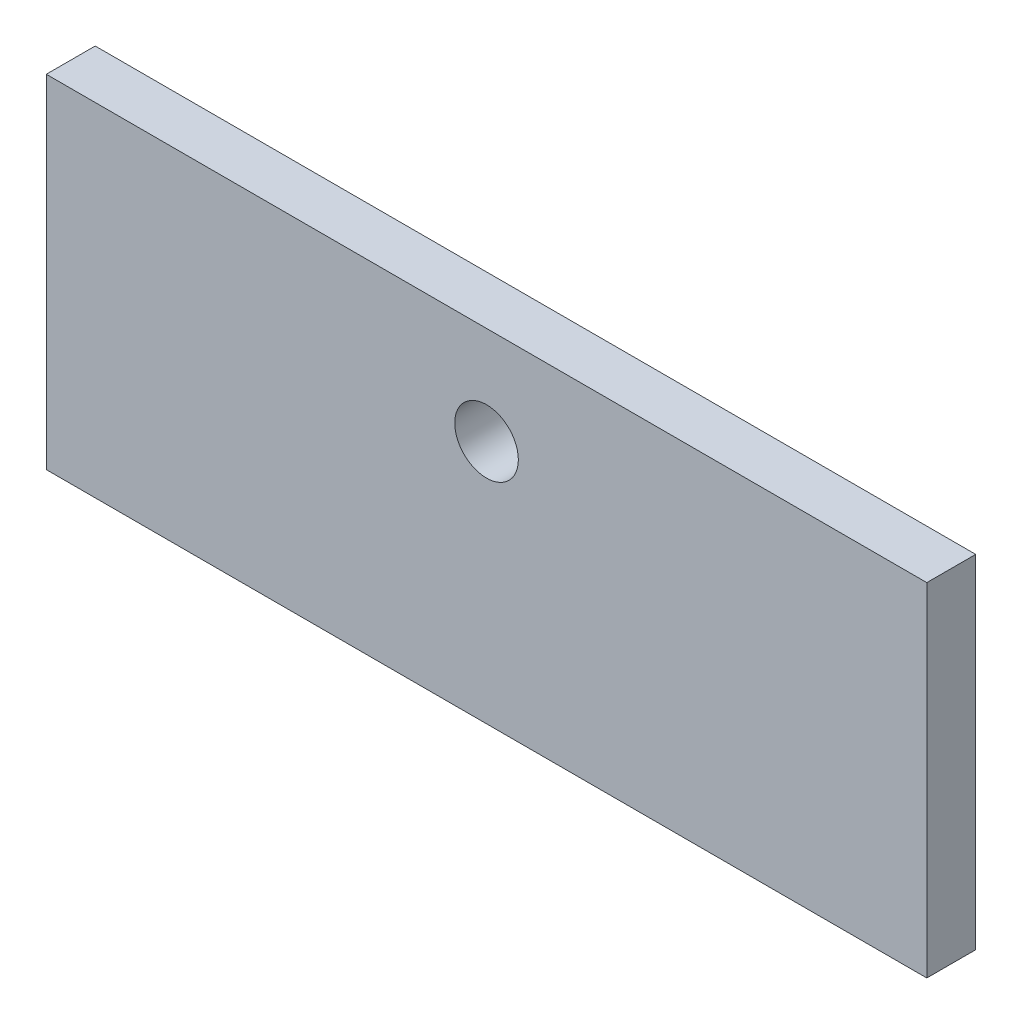
ISO-10303-21;
HEADER;
FILE_DESCRIPTION(('STEP AP214'),'2;1');
FILE_NAME('part.step','',(''),(''),'','','');
FILE_SCHEMA(('AUTOMOTIVE_DESIGN { 1 0 10303 214 1 1 1 1 }'));
ENDSEC;
DATA;
#1=APPLICATION_CONTEXT('core data for automotive mechanical design processes');
#2=APPLICATION_PROTOCOL_DEFINITION('international standard','automotive_design',2000,#1);
#3=PRODUCT_CONTEXT('',#1,'mechanical');
#4=PRODUCT('Part','Part','',(#3));
#5=PRODUCT_RELATED_PRODUCT_CATEGORY('part','',(#4));
#6=PRODUCT_DEFINITION_FORMATION('','',#4);
#7=PRODUCT_DEFINITION_CONTEXT('part definition',#1,'design');
#8=PRODUCT_DEFINITION('design','',#6,#7);
#9=PRODUCT_DEFINITION_SHAPE('','',#8);
#10=(LENGTH_UNIT() NAMED_UNIT(*) SI_UNIT(.MILLI.,.METRE.));
#11=(NAMED_UNIT(*) PLANE_ANGLE_UNIT() SI_UNIT($,.RADIAN.));
#12=(NAMED_UNIT(*) SI_UNIT($,.STERADIAN.) SOLID_ANGLE_UNIT());
#13=UNCERTAINTY_MEASURE_WITH_UNIT(LENGTH_MEASURE(1.E-05),#10,'distance_accuracy_value','');
#14=(GEOMETRIC_REPRESENTATION_CONTEXT(3) GLOBAL_UNCERTAINTY_ASSIGNED_CONTEXT((#13)) GLOBAL_UNIT_ASSIGNED_CONTEXT((#10,
#11,#12)) REPRESENTATION_CONTEXT('',''));
#15=CARTESIAN_POINT('',(0.,0.,0.));
#16=DIRECTION('',(0.,0.,1.));
#17=DIRECTION('',(1.,0.,0.));
#18=AXIS2_PLACEMENT_3D('',#15,#16,#17);
#19=CARTESIAN_POINT('',(0.,0.,5.));
#20=DIRECTION('',(0.,0.,-1.));
#21=DIRECTION('',(-1.,0.,0.));
#22=AXIS2_PLACEMENT_3D('',#19,#20,#21);
#23=PLANE('',#22);
#24=DIRECTION('',(0.,-1.,0.));
#25=VECTOR('',#24,1.);
#26=CARTESIAN_POINT('',(0.,0.,5.));
#27=LINE('',#26,#25);
#28=CARTESIAN_POINT('',(0.,35.,5.));
#29=VERTEX_POINT('',#28);
#30=CARTESIAN_POINT('',(0.,0.,5.));
#31=VERTEX_POINT('',#30);
#32=EDGE_CURVE('E87',#29,#31,#27,.T.);
#33=ORIENTED_EDGE('',*,*,#32,.T.);
#34=DIRECTION('',(1.,0.,0.));
#35=VECTOR('',#34,1.);
#36=CARTESIAN_POINT('',(0.,0.,5.));
#37=LINE('',#36,#35);
#38=CARTESIAN_POINT('',(90.,0.,5.));
#39=VERTEX_POINT('',#38);
#40=EDGE_CURVE('E82',#31,#39,#37,.T.);
#41=ORIENTED_EDGE('',*,*,#40,.T.);
#42=DIRECTION('',(0.,1.,0.));
#43=VECTOR('',#42,1.);
#44=CARTESIAN_POINT('',(90.,35.,5.));
#45=LINE('',#44,#43);
#46=CARTESIAN_POINT('',(90.,35.,5.));
#47=VERTEX_POINT('',#46);
#48=EDGE_CURVE('E85',#39,#47,#45,.T.);
#49=ORIENTED_EDGE('',*,*,#48,.T.);
#50=DIRECTION('',(-1.,0.,0.));
#51=VECTOR('',#50,1.);
#52=CARTESIAN_POINT('',(0.,35.,5.));
#53=LINE('',#52,#51);
#54=EDGE_CURVE('E52',#47,#29,#53,.T.);
#55=ORIENTED_EDGE('',*,*,#54,.T.);
#56=EDGE_LOOP('',(#33,#41,#49,#55));
#57=FACE_BOUND('',#56,.T.);
#58=CARTESIAN_POINT('',(45.,25.,5.));
#59=DIRECTION('',(0.,0.,1.));
#60=DIRECTION('',(1.,0.,0.));
#61=AXIS2_PLACEMENT_3D('',#58,#59,#60);
#62=CIRCLE('',#61,3.25);
#63=CARTESIAN_POINT('',(48.25,25.,5.));
#64=VERTEX_POINT('',#63);
#65=EDGE_CURVE('E102',#64,#64,#62,.T.);
#66=ORIENTED_EDGE('',*,*,#65,.F.);
#67=EDGE_LOOP('',(#66));
#68=FACE_BOUND('',#67,.T.);
#69=ADVANCED_FACE('F35',(#57,#68),#23,.F.);
#70=CARTESIAN_POINT('',(0.,0.,0.));
#71=DIRECTION('',(0.,0.,-1.));
#72=DIRECTION('',(-1.,0.,0.));
#73=AXIS2_PLACEMENT_3D('',#70,#71,#72);
#74=PLANE('',#73);
#75=DIRECTION('',(0.,-1.,0.));
#76=VECTOR('',#75,1.);
#77=CARTESIAN_POINT('',(0.,0.,0.));
#78=LINE('',#77,#76);
#79=CARTESIAN_POINT('',(0.,35.,0.));
#80=VERTEX_POINT('',#79);
#81=CARTESIAN_POINT('',(0.,0.,0.));
#82=VERTEX_POINT('',#81);
#83=EDGE_CURVE('E99',#80,#82,#78,.T.);
#84=ORIENTED_EDGE('',*,*,#83,.F.);
#85=DIRECTION('',(-1.,0.,0.));
#86=VECTOR('',#85,1.);
#87=CARTESIAN_POINT('',(0.,35.,0.));
#88=LINE('',#87,#86);
#89=CARTESIAN_POINT('',(90.,35.,0.));
#90=VERTEX_POINT('',#89);
#91=EDGE_CURVE('E75',#90,#80,#88,.T.);
#92=ORIENTED_EDGE('',*,*,#91,.F.);
#93=DIRECTION('',(0.,1.,0.));
#94=VECTOR('',#93,1.);
#95=CARTESIAN_POINT('',(90.,35.,0.));
#96=LINE('',#95,#94);
#97=CARTESIAN_POINT('',(90.,0.,0.));
#98=VERTEX_POINT('',#97);
#99=EDGE_CURVE('E69',#98,#90,#96,.T.);
#100=ORIENTED_EDGE('',*,*,#99,.F.);
#101=DIRECTION('',(1.,0.,0.));
#102=VECTOR('',#101,1.);
#103=CARTESIAN_POINT('',(0.,0.,0.));
#104=LINE('',#103,#102);
#105=EDGE_CURVE('E91',#82,#98,#104,.T.);
#106=ORIENTED_EDGE('',*,*,#105,.F.);
#107=EDGE_LOOP('',(#84,#92,#100,#106));
#108=FACE_BOUND('',#107,.T.);
#109=CARTESIAN_POINT('',(45.,25.,0.));
#110=DIRECTION('',(0.,0.,1.));
#111=DIRECTION('',(1.,0.,0.));
#112=AXIS2_PLACEMENT_3D('',#109,#110,#111);
#113=CIRCLE('',#112,3.25);
#114=CARTESIAN_POINT('',(48.25,25.,0.));
#115=VERTEX_POINT('',#114);
#116=EDGE_CURVE('E114',#115,#115,#113,.T.);
#117=ORIENTED_EDGE('',*,*,#116,.T.);
#118=EDGE_LOOP('',(#117));
#119=FACE_BOUND('',#118,.T.);
#120=ADVANCED_FACE('F110',(#108,#119),#74,.T.);
#121=CARTESIAN_POINT('',(0.,0.,5.));
#122=DIRECTION('',(1.,0.,0.));
#123=DIRECTION('',(0.,0.,-1.));
#124=AXIS2_PLACEMENT_3D('',#121,#122,#123);
#125=PLANE('',#124);
#126=ORIENTED_EDGE('',*,*,#83,.T.);
#127=DIRECTION('',(0.,0.,-1.));
#128=VECTOR('',#127,1.);
#129=CARTESIAN_POINT('',(0.,0.,5.));
#130=LINE('',#129,#128);
#131=EDGE_CURVE('E11',#31,#82,#130,.T.);
#132=ORIENTED_EDGE('',*,*,#131,.F.);
#133=ORIENTED_EDGE('',*,*,#32,.F.);
#134=DIRECTION('',(0.,0.,-1.));
#135=VECTOR('',#134,1.);
#136=CARTESIAN_POINT('',(0.,35.,5.));
#137=LINE('',#136,#135);
#138=EDGE_CURVE('E95',#29,#80,#137,.T.);
#139=ORIENTED_EDGE('',*,*,#138,.T.);
#140=EDGE_LOOP('',(#126,#132,#133,#139));
#141=FACE_BOUND('',#140,.T.);
#142=ADVANCED_FACE('F37',(#141),#125,.F.);
#143=CARTESIAN_POINT('',(0.,0.,5.));
#144=DIRECTION('',(0.,1.,0.));
#145=DIRECTION('',(0.,0.,1.));
#146=AXIS2_PLACEMENT_3D('',#143,#144,#145);
#147=PLANE('',#146);
#148=ORIENTED_EDGE('',*,*,#105,.T.);
#149=DIRECTION('',(0.,0.,-1.));
#150=VECTOR('',#149,1.);
#151=CARTESIAN_POINT('',(90.,0.,5.));
#152=LINE('',#151,#150);
#153=EDGE_CURVE('E44',#39,#98,#152,.T.);
#154=ORIENTED_EDGE('',*,*,#153,.F.);
#155=ORIENTED_EDGE('',*,*,#40,.F.);
#156=ORIENTED_EDGE('',*,*,#131,.T.);
#157=EDGE_LOOP('',(#148,#154,#155,#156));
#158=FACE_BOUND('',#157,.T.);
#159=ADVANCED_FACE('F90',(#158),#147,.F.);
#160=CARTESIAN_POINT('',(90.,35.,5.));
#161=DIRECTION('',(-1.,0.,0.));
#162=DIRECTION('',(0.,-1.,0.));
#163=AXIS2_PLACEMENT_3D('',#160,#161,#162);
#164=PLANE('',#163);
#165=ORIENTED_EDGE('',*,*,#99,.T.);
#166=DIRECTION('',(0.,0.,-1.));
#167=VECTOR('',#166,1.);
#168=CARTESIAN_POINT('',(90.,35.,5.));
#169=LINE('',#168,#167);
#170=EDGE_CURVE('E92',#47,#90,#169,.T.);
#171=ORIENTED_EDGE('',*,*,#170,.F.);
#172=ORIENTED_EDGE('',*,*,#48,.F.);
#173=ORIENTED_EDGE('',*,*,#153,.T.);
#174=EDGE_LOOP('',(#165,#171,#172,#173));
#175=FACE_BOUND('',#174,.T.);
#176=ADVANCED_FACE('F93',(#175),#164,.F.);
#177=CARTESIAN_POINT('',(0.,35.,5.));
#178=DIRECTION('',(0.,-1.,0.));
#179=DIRECTION('',(1.,0.,0.));
#180=AXIS2_PLACEMENT_3D('',#177,#178,#179);
#181=PLANE('',#180);
#182=ORIENTED_EDGE('',*,*,#91,.T.);
#183=ORIENTED_EDGE('',*,*,#138,.F.);
#184=ORIENTED_EDGE('',*,*,#54,.F.);
#185=ORIENTED_EDGE('',*,*,#170,.T.);
#186=EDGE_LOOP('',(#182,#183,#184,#185));
#187=FACE_BOUND('',#186,.T.);
#188=ADVANCED_FACE('F107',(#187),#181,.F.);
#189=CARTESIAN_POINT('',(45.,25.,5.));
#190=DIRECTION('',(0.,0.,-1.));
#191=DIRECTION('',(-1.,0.,0.));
#192=AXIS2_PLACEMENT_3D('',#189,#190,#191);
#193=CYLINDRICAL_SURFACE('',#192,3.25);
#194=ORIENTED_EDGE('',*,*,#65,.T.);
#195=EDGE_LOOP('',(#194));
#196=FACE_BOUND('',#195,.T.);
#197=ORIENTED_EDGE('',*,*,#116,.F.);
#198=EDGE_LOOP('',(#197));
#199=FACE_BOUND('',#198,.T.);
#200=ADVANCED_FACE('F120',(#196,#199),#193,.F.);
#201=CLOSED_SHELL('',(#69,#120,#142,#159,#176,#188,#200));
#202=MANIFOLD_SOLID_BREP('B2',#201);
#203=ADVANCED_BREP_SHAPE_REPRESENTATION('',(#18,#202),#14);
#204=SHAPE_DEFINITION_REPRESENTATION(#9,#203);
ENDSEC;
END-ISO-10303-21;
